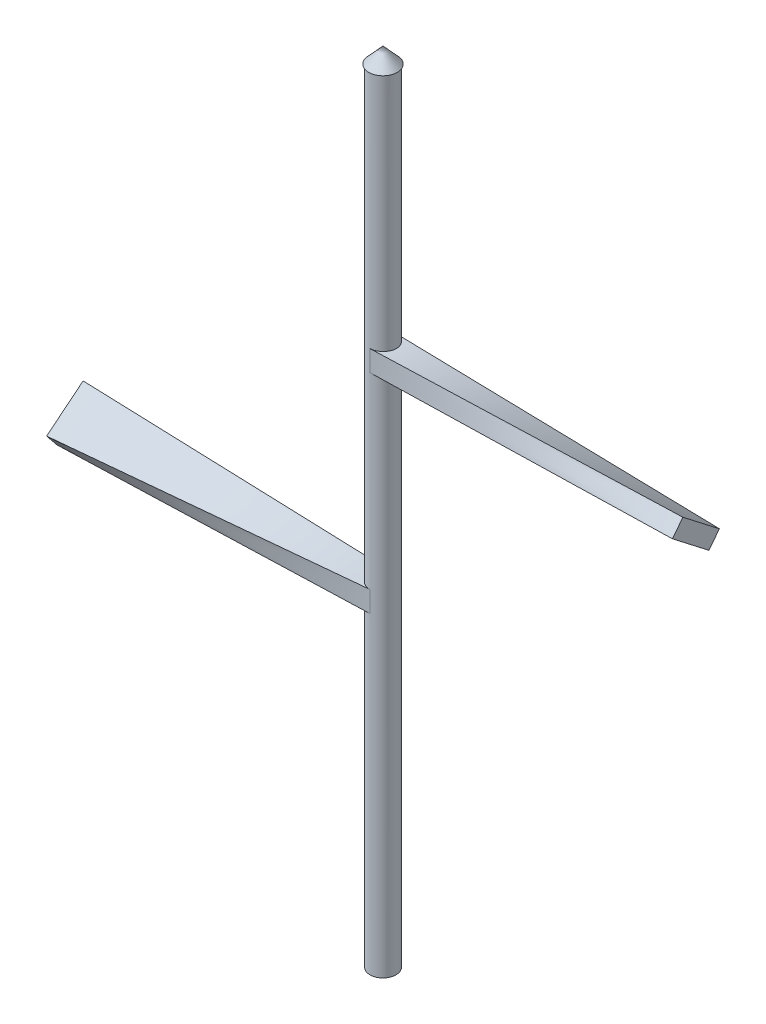
ISO-10303-21;
HEADER;
FILE_DESCRIPTION(('STEP AP214'),'2;1');
FILE_NAME('part.step','',(''),(''),'','','');
FILE_SCHEMA(('AUTOMOTIVE_DESIGN { 1 0 10303 214 1 1 1 1 }'));
ENDSEC;
DATA;
#1=APPLICATION_CONTEXT('core data for automotive mechanical design processes');
#2=APPLICATION_PROTOCOL_DEFINITION('international standard','automotive_design',2000,#1);
#3=PRODUCT_CONTEXT('',#1,'mechanical');
#4=PRODUCT('Part','Part','',(#3));
#5=PRODUCT_RELATED_PRODUCT_CATEGORY('part','',(#4));
#6=PRODUCT_DEFINITION_FORMATION('','',#4);
#7=PRODUCT_DEFINITION_CONTEXT('part definition',#1,'design');
#8=PRODUCT_DEFINITION('design','',#6,#7);
#9=PRODUCT_DEFINITION_SHAPE('','',#8);
#10=(LENGTH_UNIT() NAMED_UNIT(*) SI_UNIT(.MILLI.,.METRE.));
#11=(NAMED_UNIT(*) PLANE_ANGLE_UNIT() SI_UNIT($,.RADIAN.));
#12=(NAMED_UNIT(*) SI_UNIT($,.STERADIAN.) SOLID_ANGLE_UNIT());
#13=UNCERTAINTY_MEASURE_WITH_UNIT(LENGTH_MEASURE(1.E-05),#10,'distance_accuracy_value','');
#14=(GEOMETRIC_REPRESENTATION_CONTEXT(3) GLOBAL_UNCERTAINTY_ASSIGNED_CONTEXT((#13)) GLOBAL_UNIT_ASSIGNED_CONTEXT((#10,
#11,#12)) REPRESENTATION_CONTEXT('',''));
#15=CARTESIAN_POINT('',(0.,0.,0.));
#16=DIRECTION('',(0.,0.,1.));
#17=DIRECTION('',(1.,0.,0.));
#18=AXIS2_PLACEMENT_3D('',#15,#16,#17);
#19=CARTESIAN_POINT('',(0.,150.,0.));
#20=DIRECTION('',(0.,-1.,0.));
#21=DIRECTION('',(0.,0.,-1.));
#22=AXIS2_PLACEMENT_3D('',#19,#20,#21);
#23=CYLINDRICAL_SURFACE('',#22,2.5);
#24=DIRECTION('',(0.,1.,0.));
#25=VECTOR('',#24,1.);
#26=CARTESIAN_POINT('',(0.,100.,-2.5));
#27=LINE('',#26,#25);
#28=CARTESIAN_POINT('',(0.,100.,-2.5));
#29=VERTEX_POINT('',#28);
#30=CARTESIAN_POINT('',(0.,104.,-2.5));
#31=VERTEX_POINT('',#30);
#32=EDGE_CURVE('E61',#29,#31,#27,.T.);
#33=ORIENTED_EDGE('',*,*,#32,.F.);
#34=CARTESIAN_POINT('',(0.,100.,-2.5));
#35=CARTESIAN_POINT('',(0.0702584048415939,99.9976576322186,-2.50000655912667));
#36=CARTESIAN_POINT('',(0.140513784563137,99.9953161459847,-2.49703826712));
#37=CARTESIAN_POINT('',(0.280526146021535,99.9907165674693,-2.48520273241644));
#38=CARTESIAN_POINT('',(0.350283146028925,99.9884584721179,-2.47633570709955));
#39=CARTESIAN_POINT('',(0.488770920313989,99.9841084009593,-2.45276038404674));
#40=CARTESIAN_POINT('',(0.55750227393311,99.9820163282479,-2.43805552428509));
#41=CARTESIAN_POINT('',(0.693472263104744,99.978072177134,-2.40292192943971));
#42=CARTESIAN_POINT('',(0.760710920949553,99.9762200951456,-2.38249327989866));
#43=CARTESIAN_POINT('',(0.959547453109919,99.9711281001252,-2.31278084259678));
#44=CARTESIAN_POINT('',(1.08831540369415,99.9683508020515,-2.25506209464431));
#45=CARTESIAN_POINT('',(1.33425195770859,99.9644737576012,-2.11885689939968));
#46=CARTESIAN_POINT('',(1.45142343804616,99.9633735941727,-2.04037562081029));
#47=CARTESIAN_POINT('',(1.67073493496233,99.9630754896487,-1.86502157001248));
#48=CARTESIAN_POINT('',(1.7729039677277,99.9638738238192,-1.76818515258417));
#49=CARTESIAN_POINT('',(1.95957114399066,99.967367199174,-1.55876984295282));
#50=CARTESIAN_POINT('',(2.04406648750235,99.9700625406004,-1.44618846103269));
#51=CARTESIAN_POINT('',(2.19292102579206,99.9771206432,-1.20860660242059));
#52=CARTESIAN_POINT('',(2.25729786480343,99.9814819358053,-1.0836171353114));
#53=CARTESIAN_POINT('',(2.36421703627165,99.9914450882955,-0.824680540386848));
#54=CARTESIAN_POINT('',(2.40676041002195,99.9970468889991,-0.690733840109166));
#55=CARTESIAN_POINT('',(2.46892760178903,100.008926800215,-0.417267313309697));
#56=CARTESIAN_POINT('',(2.48848863205369,100.015206712522,-0.277733291299046));
#57=CARTESIAN_POINT('',(2.50393825596587,100.02775255579,0.00264463678888551));
#58=CARTESIAN_POINT('',(2.49982592779531,100.034018486197,0.143488593660581));
#59=CARTESIAN_POINT('',(2.46800050571145,100.045849556327,0.422815749919098));
#60=CARTESIAN_POINT('',(2.44023816678884,100.051413205958,0.561293407933878));
#61=CARTESIAN_POINT('',(2.36181280267317,100.061174703019,0.831655437760597));
#62=CARTESIAN_POINT('',(2.31115020392026,100.06537257588,0.963539932297192));
#63=CARTESIAN_POINT('',(2.18847831679041,100.07187179952,1.21667640291507));
#64=CARTESIAN_POINT('',(2.11651536692919,100.074177226617,1.33795072678713));
#65=CARTESIAN_POINT('',(1.95324618562544,100.076571451202,1.56670775669221));
#66=CARTESIAN_POINT('',(1.86194134947254,100.076660408527,1.674191456659));
#67=CARTESIAN_POINT('',(1.66298236917651,100.074518430425,1.87192092763172));
#68=CARTESIAN_POINT('',(1.55539153434483,100.072296290729,1.96223051917284));
#69=CARTESIAN_POINT('',(1.32663141731793,100.065678149089,2.12359176094705));
#70=CARTESIAN_POINT('',(1.20545802328622,100.061281487472,2.19463755709287));
#71=CARTESIAN_POINT('',(0.95291145125366,100.050673764346,2.31551113889691));
#72=CARTESIAN_POINT('',(0.821528470030512,100.044460942757,2.36531822599241));
#73=CARTESIAN_POINT('',(0.552443773385331,100.030782119729,2.44219676685281));
#74=CARTESIAN_POINT('',(0.414751387738073,100.023317927848,2.46930071616746));
#75=CARTESIAN_POINT('',(0.230100518819235,100.013025135043,2.489818216514));
#76=CARTESIAN_POINT('',(0.184120423197905,100.010439074192,2.49363848895817));
#77=CARTESIAN_POINT('',(0.0920997744488327,100.00523689554,2.49872592379748));
#78=CARTESIAN_POINT('',(0.0460594583708322,100.002620836558,2.49999743169767));
#79=CARTESIAN_POINT('',(0.,100.,2.5));
#80=B_SPLINE_CURVE_WITH_KNOTS('',3,(#34,#35,#36,#37,#38,#39,#40,#41,#42,#43,#44,#45,#46,#47,#48,
#49,#50,#51,#52,#53,#54,#55,#56,#57,#58,#59,#60,#61,#62,#63,#64,#65,#66,#67,#68,#69,#70,#71,#72,
#73,#74,#75,#76,#77,#78,#79),.UNSPECIFIED.,.F.,.F.,(4,2,2,2,2,2,2,2,2,2,2,2,2,2,2,2,2,2,2,2,2,2,
4),(0.,0.210824140476443,0.421640512096262,0.632332915030588,0.843022169311802,1.26425178750117,
1.68537664171326,2.10567595700975,2.52604180862919,2.94603795164931,3.36601406212371,
3.78713489868116,4.20827213339457,4.63028842656643,5.05229686143123,5.47339388928997,
5.89446055028876,6.31393053048177,6.73352784117477,7.15353314847114,7.57293625975724,
7.71151834173003,7.84986394713253),.UNSPECIFIED.);
#81=CARTESIAN_POINT('',(0.,100.,2.5));
#82=VERTEX_POINT('',#81);
#83=EDGE_CURVE('E12',#29,#82,#80,.T.);
#84=ORIENTED_EDGE('',*,*,#83,.T.);
#85=DIRECTION('',(0.,-1.,0.));
#86=VECTOR('',#85,1.);
#87=CARTESIAN_POINT('',(0.,100.,2.5));
#88=LINE('',#87,#86);
#89=CARTESIAN_POINT('',(0.,104.,2.5));
#90=VERTEX_POINT('',#89);
#91=EDGE_CURVE('E164',#90,#82,#88,.T.);
#92=ORIENTED_EDGE('',*,*,#91,.F.);
#93=CARTESIAN_POINT('',(0.,104.,2.5));
#94=CARTESIAN_POINT('',(0.0702584048415934,104.002342367781,2.50000655912667));
#95=CARTESIAN_POINT('',(0.140513784563137,104.004683854015,2.49703826712));
#96=CARTESIAN_POINT('',(0.280526146021536,104.009283432531,2.48520273241644));
#97=CARTESIAN_POINT('',(0.350283146028927,104.011541527882,2.47633570709955));
#98=CARTESIAN_POINT('',(0.488770920313991,104.015891599041,2.45276038404674));
#99=CARTESIAN_POINT('',(0.557502273933111,104.017983671752,2.43805552428509));
#100=CARTESIAN_POINT('',(0.693472263104745,104.021927822866,2.40292192943971));
#101=CARTESIAN_POINT('',(0.760710920949554,104.023779904854,2.38249327989866));
#102=CARTESIAN_POINT('',(0.95954745310992,104.028871899875,2.31278084259678));
#103=CARTESIAN_POINT('',(1.08831540369415,104.031649197948,2.25506209464431));
#104=CARTESIAN_POINT('',(1.33425195770859,104.035526242399,2.11885689939968));
#105=CARTESIAN_POINT('',(1.45142343804616,104.036626405827,2.04037562081029));
#106=CARTESIAN_POINT('',(1.67073493496234,104.036924510351,1.86502157001248));
#107=CARTESIAN_POINT('',(1.7729039677277,104.036126176181,1.76818515258417));
#108=CARTESIAN_POINT('',(1.95957114399066,104.032632800826,1.55876984295282));
#109=CARTESIAN_POINT('',(2.04406648750235,104.0299374594,1.44618846103268));
#110=CARTESIAN_POINT('',(2.19292102579206,104.0228793568,1.20860660242058));
#111=CARTESIAN_POINT('',(2.25729786480343,104.018518064195,1.08361713531139));
#112=CARTESIAN_POINT('',(2.36421703627165,104.008554911704,0.824680540386844));
#113=CARTESIAN_POINT('',(2.40676041002195,104.002953111001,0.690733840109162));
#114=CARTESIAN_POINT('',(2.46892760178903,103.991073199785,0.417267313309692));
#115=CARTESIAN_POINT('',(2.48848863205369,103.984793287478,0.277733291299043));
#116=CARTESIAN_POINT('',(2.50393825596587,103.97224744421,-0.00264463678888768));
#117=CARTESIAN_POINT('',(2.49982592779531,103.965981513803,-0.143488593660584));
#118=CARTESIAN_POINT('',(2.46800050571145,103.954150443673,-0.422815749919101));
#119=CARTESIAN_POINT('',(2.44023816678884,103.948586794042,-0.561293407933881));
#120=CARTESIAN_POINT('',(2.36181280267317,103.938825296981,-0.831655437760601));
#121=CARTESIAN_POINT('',(2.31115020392026,103.93462742412,-0.963539932297197));
#122=CARTESIAN_POINT('',(2.1884783167904,103.92812820048,-1.21667640291507));
#123=CARTESIAN_POINT('',(2.11651536692918,103.925822773383,-1.33795072678713));
#124=CARTESIAN_POINT('',(1.95324618562544,103.923428548798,-1.56670775669221));
#125=CARTESIAN_POINT('',(1.86194134947254,103.923339591473,-1.674191456659));
#126=CARTESIAN_POINT('',(1.66298236917651,103.925481569575,-1.87192092763172));
#127=CARTESIAN_POINT('',(1.55539153434483,103.927703709271,-1.96223051917284));
#128=CARTESIAN_POINT('',(1.32663141731793,103.934321850911,-2.12359176094706));
#129=CARTESIAN_POINT('',(1.20545802328621,103.938718512528,-2.19463755709287));
#130=CARTESIAN_POINT('',(0.952911451253658,103.949326235654,-2.31551113889691));
#131=CARTESIAN_POINT('',(0.821528470030512,103.955539057243,-2.36531822599242));
#132=CARTESIAN_POINT('',(0.55244377338533,103.969217880271,-2.44219676685281));
#133=CARTESIAN_POINT('',(0.414751387738071,103.976682072152,-2.46930071616745));
#134=CARTESIAN_POINT('',(0.230100518819235,103.986974864957,-2.489818216514));
#135=CARTESIAN_POINT('',(0.184120423197906,103.989560925808,-2.49363848895817));
#136=CARTESIAN_POINT('',(0.0920997744488342,103.99476310446,-2.49872592379748));
#137=CARTESIAN_POINT('',(0.0460594583708336,103.997379163442,-2.49999743169767));
#138=CARTESIAN_POINT('',(0.,104.,-2.5));
#139=B_SPLINE_CURVE_WITH_KNOTS('',3,(#93,#94,#95,#96,#97,#98,#99,#100,#101,#102,#103,#104,#105,
#106,#107,#108,#109,#110,#111,#112,#113,#114,#115,#116,#117,#118,#119,#120,#121,#122,#123,#124,
#125,#126,#127,#128,#129,#130,#131,#132,#133,#134,#135,#136,#137,#138),.UNSPECIFIED.,.F.,.F.,(4,
2,2,2,2,2,2,2,2,2,2,2,2,2,2,2,2,2,2,2,2,2,4),(0.,0.210824140476443,0.421640512096263,
0.632332915030589,0.843022169311803,1.26425178750117,1.68537664171327,2.10567595700975,
2.52604180862919,2.94603795164931,3.36601406212372,3.78713489868117,4.20827213339457,
4.63028842656643,5.05229686143123,5.47339388928997,5.89446055028876,6.31393053048177,
6.73352784117478,7.15353314847115,7.57293625975723,7.71151834173003,7.84986394713253),.UNSPECIFIED.);
#140=EDGE_CURVE('E68',#90,#31,#139,.T.);
#141=ORIENTED_EDGE('',*,*,#140,.T.);
#142=EDGE_LOOP('',(#33,#84,#92,#141));
#143=FACE_BOUND('',#142,.T.);
#144=CARTESIAN_POINT('',(0.,64.,-2.5));
#145=CARTESIAN_POINT('',(-0.070253171884218,64.0025038124168,-2.5000065378278));
#146=CARTESIAN_POINT('',(-0.140503337708207,64.0050067017248,-2.49703870703915));
#147=CARTESIAN_POINT('',(-0.280505799307064,64.0099248428953,-2.48520489470651));
#148=CARTESIAN_POINT('',(-0.350258112724583,64.0123400978758,-2.47633912323032));
#149=CARTESIAN_POINT('',(-0.488738280731921,64.0169960314195,-2.45276678491321));
#150=CARTESIAN_POINT('',(-0.557466701054271,64.0192368095165,-2.43806357779134));
#151=CARTESIAN_POINT('',(-0.693431841841638,64.0234660797212,-2.40293351321847));
#152=CARTESIAN_POINT('',(-0.76066858503533,64.0254545756752,-2.38250674304211));
#153=CARTESIAN_POINT('',(-0.95950210082307,64.0309320427756,-2.31279949224505));
#154=CARTESIAN_POINT('',(-1.08827067283518,64.0339347069079,-2.25508377265722));
#155=CARTESIAN_POINT('',(-1.33421118805541,64.0381753402809,-2.11888257614063));
#156=CARTESIAN_POINT('',(-1.45138607431908,64.0394137584503,-2.04040238895059));
#157=CARTESIAN_POINT('',(-1.67068033885718,64.0398879850759,-1.86506832017234));
#158=CARTESIAN_POINT('',(-1.7728320586053,64.0391281639547,-1.76825496571874));
#159=CARTESIAN_POINT('',(-1.95947165211729,64.0356106675047,-1.55889231278482));
#160=CARTESIAN_POINT('',(-2.04395672023821,64.0328526751561,-1.44634051961017));
#161=CARTESIAN_POINT('',(-2.19278891492967,64.0255774480267,-1.20884053722357));
#162=CARTESIAN_POINT('',(-2.25715629479556,64.0210619929083,-1.08390498328533));
#163=CARTESIAN_POINT('',(-2.36407306429519,64.0107169786385,-0.825084071320989));
#164=CARTESIAN_POINT('',(-2.40662346329096,64.0048874802993,-0.691199127662156));
#165=CARTESIAN_POINT('',(-2.46883219109955,63.9925018785632,-0.417824016793933));
#166=CARTESIAN_POINT('',(-2.48842188951259,63.9859436606303,-0.278318327874358));
#167=CARTESIAN_POINT('',(-2.5039375109802,63.9728233636013,0.002007603543178));
#168=CARTESIAN_POINT('',(-2.49986246906174,63.9662612843588,0.142827899412874));
#169=CARTESIAN_POINT('',(-2.46811466478618,63.9538502586572,0.42215289855813));
#170=CARTESIAN_POINT('',(-2.44038666630136,63.9480030181151,0.560651407253054));
#171=CARTESIAN_POINT('',(-2.36202201374373,63.9377206691581,0.831063674889947));
#172=CARTESIAN_POINT('',(-2.31138581083384,63.9332855329357,0.962977563455134));
#173=CARTESIAN_POINT('',(-2.18876503943008,63.926385254899,1.2161604383166));
#174=CARTESIAN_POINT('',(-2.11682997484023,63.9239155933824,1.33745327275595));
#175=CARTESIAN_POINT('',(-1.95361079663825,63.9212823021598,1.56625331128603));
#176=CARTESIAN_POINT('',(-1.86232811920887,63.9211185013493,1.67376153766479));
#177=CARTESIAN_POINT('',(-1.66344261970678,63.923207302732,1.8715086934876));
#178=CARTESIAN_POINT('',(-1.55590878748201,63.9254499236392,1.96181714077756));
#179=CARTESIAN_POINT('',(-1.32726897033966,63.9321997828831,2.12319032744711));
#180=CARTESIAN_POINT('',(-1.20615889652163,63.936707704916,2.19424924710781));
#181=CARTESIAN_POINT('',(-0.953746306898589,63.9476147735161,2.31516419140071));
#182=CARTESIAN_POINT('',(-0.822434200804892,63.9540157158476,2.36499997323069));
#183=CARTESIAN_POINT('',(-0.55349135216114,63.9681251494521,2.44195634061913));
#184=CARTESIAN_POINT('',(-0.415869882611662,63.9758317640147,2.46910920188487));
#185=CARTESIAN_POINT('',(-0.231090380651679,63.9864765867563,2.48973024985742));
#186=CARTESIAN_POINT('',(-0.184912990630358,63.989161201253,2.49358353481704));
#187=CARTESIAN_POINT('',(-0.0924966510669358,63.9945622426746,2.49871492563506));
#188=CARTESIAN_POINT('',(-0.0462579420412805,63.9972786073086,2.49999742637732));
#189=CARTESIAN_POINT('',(0.,64.,2.5));
#190=B_SPLINE_CURVE_WITH_KNOTS('',3,(#144,#145,#146,#147,#148,#149,#150,#151,#152,#153,#154,
#155,#156,#157,#158,#159,#160,#161,#162,#163,#164,#165,#166,#167,#168,#169,#170,#171,#172,#173,
#174,#175,#176,#177,#178,#179,#180,#181,#182,#183,#184,#185,#186,#187,#188,#189),.UNSPECIFIED.,
.F.,.F.,(4,2,2,2,2,2,2,2,2,2,2,2,2,2,2,2,2,2,2,2,2,2,4),(0.,0.210825190348227,0.421642872107563,
0.632339393855028,0.843032703013024,1.26427344062697,1.68540697050397,2.10562019018408,
2.52590009337624,2.94575551054903,3.36559150136952,3.78667922317472,4.20778411572184,
4.6298751040861,5.05195777999098,5.47306702943345,5.89414503067163,6.31348322386356,
6.73294805463915,7.15281208314751,7.57207766125695,7.71127286460633,7.85022990317063),.UNSPECIFIED.);
#191=CARTESIAN_POINT('',(0.,64.0000000000014,-2.5));
#192=VERTEX_POINT('',#191);
#193=CARTESIAN_POINT('',(0.,64.,2.5));
#194=VERTEX_POINT('',#193);
#195=EDGE_CURVE('E515',#192,#194,#190,.T.);
#196=ORIENTED_EDGE('',*,*,#195,.T.);
#197=DIRECTION('',(0.,-1.,0.));
#198=VECTOR('',#197,1.);
#199=CARTESIAN_POINT('',(0.,60.,2.5));
#200=LINE('',#199,#198);
#201=CARTESIAN_POINT('',(0.,60.,2.5));
#202=VERTEX_POINT('',#201);
#203=EDGE_CURVE('E337',#194,#202,#200,.T.);
#204=ORIENTED_EDGE('',*,*,#203,.T.);
#205=CARTESIAN_POINT('',(0.,60.,2.5));
#206=CARTESIAN_POINT('',(-0.0702527969150094,59.9976577997655,2.50000655147175));
#207=CARTESIAN_POINT('',(-0.140502578825205,59.9953165167065,2.49703873938094));
#208=CARTESIAN_POINT('',(-0.280504008092741,59.9907204498881,2.48520507785324));
#209=CARTESIAN_POINT('',(-0.350255673378449,59.9884656630025,2.47633944178508));
#210=CARTESIAN_POINT('',(-0.488733619301485,59.9841283340108,2.45276767499933));
#211=CARTESIAN_POINT('',(-0.557460472955953,59.9820456924452,2.43806494564606));
#212=CARTESIAN_POINT('',(-0.69342195477876,59.9781292654996,2.40293630944267));
#213=CARTESIAN_POINT('',(-0.760656605514443,59.9762954763538,2.3825104892095));
#214=CARTESIAN_POINT('',(-0.959482547207748,59.9712755099404,2.31280725137865));
#215=CARTESIAN_POINT('',(-1.08824473786535,59.9685691184443,2.25509568983023));
#216=CARTESIAN_POINT('',(-1.33417111426784,59.9648941415935,2.11890721668262));
#217=CARTESIAN_POINT('',(-1.45133821581693,59.9639251182903,2.0404355439314));
#218=CARTESIAN_POINT('',(-1.67062947053721,59.9639546680744,1.86511408466713));
#219=CARTESIAN_POINT('',(-1.77278433330633,59.9649491625771,1.7683027705553));
#220=CARTESIAN_POINT('',(-1.95942914284807,59.9688953402579,1.5589457278831));
#221=CARTESIAN_POINT('',(-2.04391627263972,59.9718473352316,1.44639749496112));
#222=CARTESIAN_POINT('',(-2.19276473971063,59.9794648209756,1.20888667351689));
#223=CARTESIAN_POINT('',(-2.25714321477403,59.9841288452376,1.08393477649287));
#224=CARTESIAN_POINT('',(-2.36407642807152,59.9947212169921,0.825077798768885));
#225=CARTESIAN_POINT('',(-2.40663217009598,60.0006495063138,0.691173130194014));
#226=CARTESIAN_POINT('',(-2.46884517295777,60.013180286222,0.417754663089677));
#227=CARTESIAN_POINT('',(-2.48843367393131,60.0197847372692,0.278225308462723));
#228=CARTESIAN_POINT('',(-2.50393874438485,60.0329429715453,-0.00214988960053474));
#229=CARTESIAN_POINT('',(-2.49985436949641,60.0394967527424,-0.142995785333081));
#230=CARTESIAN_POINT('',(-2.468081378002,60.0518353768941,-0.422348799055669));
#231=CARTESIAN_POINT('',(-2.44034133402629,60.0576185127711,-0.560850150464521));
#232=CARTESIAN_POINT('',(-2.36195094204194,60.0677195583052,-0.831266545526496));
#233=CARTESIAN_POINT('',(-2.31130107419357,60.0720374986676,-0.963181727152882));
#234=CARTESIAN_POINT('',(-2.18866388922046,60.078653233873,-1.21634011293473));
#235=CARTESIAN_POINT('',(-2.11673004285035,60.0809560345574,-1.33760908470625));
#236=CARTESIAN_POINT('',(-1.95352190384461,60.0832117245833,-1.56636217733326));
#237=CARTESIAN_POINT('',(-1.86224905325937,60.0831647890761,-1.67384732504758));
#238=CARTESIAN_POINT('',(-1.66339609380616,60.0806179649605,-1.87154780339159));
#239=CARTESIAN_POINT('',(-1.55588544513205,60.0781282875539,-1.9618331571124));
#240=CARTESIAN_POINT('',(-1.32730291943691,60.0708543815013,-2.12316682490628));
#241=CARTESIAN_POINT('',(-1.20622694919535,60.0660694588477,-2.19420931038845));
#242=CARTESIAN_POINT('',(-0.953871359572034,60.0545851802151,-2.31511163129533));
#243=CARTESIAN_POINT('',(-0.82258052904572,60.047883698543,-2.36494779282647));
#244=CARTESIAN_POINT('',(-0.553684013915809,60.033158976334,-2.44191147677551));
#245=CARTESIAN_POINT('',(-0.416087578079909,60.0251376296036,-2.46907120213091));
#246=CARTESIAN_POINT('',(-0.231292900481339,60.0140671976331,-2.48971220480168));
#247=CARTESIAN_POINT('',(-0.185075094510981,60.0112739669301,-2.493572265424));
#248=CARTESIAN_POINT('',(-0.0925777783029553,60.0056554755155,-2.49871267333773));
#249=CARTESIAN_POINT('',(-0.0462985092071827,60.0028302778341,-2.49999742627932));
#250=CARTESIAN_POINT('',(0.,60.,-2.5));
#251=B_SPLINE_CURVE_WITH_KNOTS('',3,(#205,#206,#207,#208,#209,#210,#211,#212,#213,#214,#215,
#216,#217,#218,#219,#220,#221,#222,#223,#224,#225,#226,#227,#228,#229,#230,#231,#232,#233,#234,
#235,#236,#237,#238,#239,#240,#241,#242,#243,#244,#245,#246,#247,#248,#249,#250),.UNSPECIFIED.,
.F.,.F.,(4,2,2,2,2,2,2,2,2,2,2,2,2,2,2,2,2,2,2,2,2,2,4),(0.,0.210807339037184,0.421607051998983,
0.63228410858744,0.842957976825325,1.26415864990337,1.68525313352361,2.10547384731568,
2.52576151099437,2.94568999712437,3.36559916587621,3.78676228431101,4.20794220407979,
4.63004010917243,5.05212916804883,5.47316670763569,5.89417286278332,6.31342658472497,
6.73280715536053,7.15265468520301,7.57190496812712,7.7112415360016,7.85033953282088),.UNSPECIFIED.);
#252=CARTESIAN_POINT('',(0.,60.,-2.5));
#253=VERTEX_POINT('',#252);
#254=EDGE_CURVE('E498',#202,#253,#251,.T.);
#255=ORIENTED_EDGE('',*,*,#254,.T.);
#256=DIRECTION('',(0.,1.,0.));
#257=VECTOR('',#256,1.);
#258=CARTESIAN_POINT('',(0.,60.,-2.5));
#259=LINE('',#258,#257);
#260=EDGE_CURVE('E307',#253,#192,#259,.T.);
#261=ORIENTED_EDGE('',*,*,#260,.T.);
#262=EDGE_LOOP('',(#196,#204,#255,#261));
#263=FACE_BOUND('',#262,.T.);
#264=CARTESIAN_POINT('',(0.,150.,0.));
#265=DIRECTION('',(0.,1.,0.));
#266=DIRECTION('',(0.,0.,1.));
#267=AXIS2_PLACEMENT_3D('',#264,#265,#266);
#268=CIRCLE('',#267,2.5);
#269=CARTESIAN_POINT('',(0.,150.,2.5));
#270=VERTEX_POINT('',#269);
#271=EDGE_CURVE('E494',#270,#270,#268,.T.);
#272=ORIENTED_EDGE('',*,*,#271,.F.);
#273=EDGE_LOOP('',(#272));
#274=FACE_BOUND('',#273,.T.);
#275=DIRECTION('',(0.,-1.,0.));
#276=VECTOR('',#275,1.);
#277=CARTESIAN_POINT('',(-1.33316955610599,10.,-2.11486617417561));
#278=LINE('',#277,#276);
#279=CARTESIAN_POINT('',(-1.33316955610599,10.,-2.11486617417561));
#280=VERTEX_POINT('',#279);
#281=CARTESIAN_POINT('',(-1.33316955610599,0.,-2.11486617417561));
#282=VERTEX_POINT('',#281);
#283=EDGE_CURVE('E483',#280,#282,#278,.T.);
#284=ORIENTED_EDGE('',*,*,#283,.F.);
#285=CARTESIAN_POINT('',(0.,10.,0.));
#286=DIRECTION('',(0.,-1.,0.));
#287=DIRECTION('',(0.,0.,-1.));
#288=AXIS2_PLACEMENT_3D('',#285,#286,#287);
#289=CIRCLE('',#288,2.5);
#290=CARTESIAN_POINT('',(-2.42946149862482,10.,0.589675187454604));
#291=VERTEX_POINT('',#290);
#292=EDGE_CURVE('E475',#291,#280,#289,.T.);
#293=ORIENTED_EDGE('',*,*,#292,.F.);
#294=DIRECTION('',(0.,-1.,0.));
#295=VECTOR('',#294,1.);
#296=CARTESIAN_POINT('',(-2.42946149862482,10.,0.589675187454604));
#297=LINE('',#296,#295);
#298=CARTESIAN_POINT('',(-2.42946149862482,0.,0.589675187454604));
#299=VERTEX_POINT('',#298);
#300=EDGE_CURVE('E479',#291,#299,#297,.T.);
#301=ORIENTED_EDGE('',*,*,#300,.T.);
#302=CARTESIAN_POINT('',(0.,0.,0.));
#303=DIRECTION('',(0.,1.,0.));
#304=DIRECTION('',(0.,0.,1.));
#305=AXIS2_PLACEMENT_3D('',#302,#303,#304);
#306=CIRCLE('',#305,2.5);
#307=EDGE_CURVE('E493',#299,#282,#306,.T.);
#308=ORIENTED_EDGE('',*,*,#307,.T.);
#309=EDGE_LOOP('',(#284,#293,#301,#308));
#310=FACE_BOUND('',#309,.T.);
#311=ADVANCED_FACE('F57',(#143,#263,#274,#310),#23,.T.);
#312=CARTESIAN_POINT('',(0.,0.,0.));
#313=DIRECTION('',(0.,1.,0.));
#314=DIRECTION('',(0.,0.,1.));
#315=AXIS2_PLACEMENT_3D('',#312,#313,#314);
#316=PLANE('',#315);
#317=DIRECTION('',(0.375662804611088,0.,-0.926756417421391));
#318=VECTOR('',#317,1.);
#319=CARTESIAN_POINT('',(-1.88131552736541,0.,-0.762595493360501));
#320=LINE('',#319,#318);
#321=EDGE_CURVE('E453',#299,#282,#320,.T.);
#322=ORIENTED_EDGE('',*,*,#321,.T.);
#323=ORIENTED_EDGE('',*,*,#307,.F.);
#324=EDGE_LOOP('',(#322,#323));
#325=FACE_BOUND('',#324,.T.);
#326=ADVANCED_FACE('F608',(#325),#316,.F.);
#327=CARTESIAN_POINT('',(0.,153.,0.));
#328=DIRECTION('',(0.,-1.,0.));
#329=DIRECTION('',(0.,0.,-1.));
#330=AXIS2_PLACEMENT_3D('',#327,#328,#329);
#331=CONICAL_SURFACE('',#330,0.,0.741947268005913);
#332=CARTESIAN_POINT('',(0.,150.,0.));
#333=DIRECTION('',(0.,1.,0.));
#334=DIRECTION('',(0.,0.,1.));
#335=AXIS2_PLACEMENT_3D('',#332,#333,#334);
#336=CIRCLE('',#335,2.75);
#337=CARTESIAN_POINT('',(0.,150.,2.75));
#338=VERTEX_POINT('',#337);
#339=EDGE_CURVE('E486',#338,#338,#336,.T.);
#340=ORIENTED_EDGE('',*,*,#339,.T.);
#341=EDGE_LOOP('',(#340));
#342=FACE_BOUND('',#341,.T.);
#343=CARTESIAN_POINT('',(0.,153.,0.));
#344=VERTEX_POINT('',#343);
#345=VERTEX_LOOP('',#344);
#346=FACE_BOUND('',#345,.T.);
#347=ADVANCED_FACE('F619',(#342,#346),#331,.T.);
#348=CARTESIAN_POINT('',(0.,150.,0.));
#349=DIRECTION('',(0.,-1.,0.));
#350=DIRECTION('',(0.,0.,-1.));
#351=AXIS2_PLACEMENT_3D('',#348,#349,#350);
#352=PLANE('',#351);
#353=ORIENTED_EDGE('',*,*,#271,.T.);
#354=EDGE_LOOP('',(#353));
#355=FACE_BOUND('',#354,.T.);
#356=ORIENTED_EDGE('',*,*,#339,.F.);
#357=EDGE_LOOP('',(#356));
#358=FACE_BOUND('',#357,.T.);
#359=ADVANCED_FACE('F624',(#355,#358),#352,.T.);
#360=CARTESIAN_POINT('',(-1.88131552736541,10.,-0.762595493360501));
#361=DIRECTION('',(-0.926756417421391,0.,-0.375662804611088));
#362=DIRECTION('',(-0.375662804611088,0.,0.926756417421391));
#363=AXIS2_PLACEMENT_3D('',#360,#361,#362);
#364=PLANE('',#363);
#365=ORIENTED_EDGE('',*,*,#321,.F.);
#366=ORIENTED_EDGE('',*,*,#300,.F.);
#367=DIRECTION('',(0.375662804611088,0.,-0.926756417421391));
#368=VECTOR('',#367,1.);
#369=CARTESIAN_POINT('',(-1.88131552736541,10.,-0.762595493360501));
#370=LINE('',#369,#368);
#371=EDGE_CURVE('E467',#291,#280,#370,.T.);
#372=ORIENTED_EDGE('',*,*,#371,.T.);
#373=ORIENTED_EDGE('',*,*,#283,.T.);
#374=EDGE_LOOP('',(#365,#366,#372,#373));
#375=FACE_BOUND('',#374,.T.);
#376=ADVANCED_FACE('F615',(#375),#364,.T.);
#377=CARTESIAN_POINT('',(0.,10.,0.));
#378=DIRECTION('',(0.,-1.,0.));
#379=DIRECTION('',(0.,0.,-1.));
#380=AXIS2_PLACEMENT_3D('',#377,#378,#379);
#381=PLANE('',#380);
#382=ORIENTED_EDGE('',*,*,#371,.F.);
#383=ORIENTED_EDGE('',*,*,#292,.T.);
#384=EDGE_LOOP('',(#382,#383));
#385=FACE_BOUND('',#384,.T.);
#386=ADVANCED_FACE('F632',(#385),#381,.T.);
#387=CARTESIAN_POINT('',(0.,64.,2.5));
#388=CARTESIAN_POINT('',(-60.,60.4700007874602,4.5));
#389=CARTESIAN_POINT('',(0.,64.,1.66666666666667));
#390=CARTESIAN_POINT('',(-60.,61.4146698520124,3.33333333333336));
#391=CARTESIAN_POINT('',(0.,64.,0.833333333333335));
#392=CARTESIAN_POINT('',(-60.,62.3593389165647,2.1666666666667));
#393=CARTESIAN_POINT('',(0.,64.,-0.833333333333331));
#394=CARTESIAN_POINT('',(-60.,64.2486770456692,-0.166666666666635));
#395=CARTESIAN_POINT('',(0.,64.,-1.66666666666666));
#396=CARTESIAN_POINT('',(-60.,65.1933461102214,-1.33333333333331));
#397=CARTESIAN_POINT('',(0.,64.,-2.5));
#398=CARTESIAN_POINT('',(-60.,66.1380151747737,-2.5));
#399=B_SPLINE_SURFACE_WITH_KNOTS('',3,1,((#387,#388),(#389,#390),(#391,#392),(#393,#394),(#395,
#396),(#397,#398)),.UNSPECIFIED.,.F.,.F.,.F.,(4,2,4),(2,2),(0.,0.5,1.),(0.,1.),.UNSPECIFIED.);
#400=DIRECTION('',(-0.99936572772833,0.035610984850532,0.));
#401=VECTOR('',#400,1.);
#402=CARTESIAN_POINT('',(-30.,65.0690075873868,-2.5));
#403=LINE('',#402,#401);
#404=CARTESIAN_POINT('',(-60.,66.1380151747737,-2.5));
#405=VERTEX_POINT('',#404);
#406=EDGE_CURVE('E84',#192,#405,#403,.T.);
#407=DIRECTION('',(0.,-0.629288617359403,0.777171690208728));
#408=VECTOR('',#407,1.);
#409=CARTESIAN_POINT('',(-60.,66.1380151747737,-2.5));
#410=LINE('',#409,#408);
#411=CARTESIAN_POINT('',(-60.,60.4700007874602,4.5));
#412=VERTEX_POINT('',#411);
#413=EDGE_CURVE('E387',#405,#412,#410,.T.);
#414=DIRECTION('',(-0.997721575213462,-0.0586992729139585,0.0332573858404487));
#415=VECTOR('',#414,1.);
#416=CARTESIAN_POINT('',(-30.,62.2350003937301,3.5));
#417=LINE('',#416,#415);
#418=EDGE_CURVE('E336',#194,#412,#417,.T.);
#419=ORIENTED_EDGE('',*,*,#195,.F.);
#420=ORIENTED_EDGE('',*,*,#406,.T.);
#421=ORIENTED_EDGE('',*,*,#413,.T.);
#422=ORIENTED_EDGE('',*,*,#418,.F.);
#423=EDGE_LOOP('',(#419,#420,#421,#422));
#424=FACE_BOUND('',#423,.T.);
#425=ADVANCED_FACE('F361',(#424),#399,.T.);
#426=CARTESIAN_POINT('',(0.,60.,-2.5));
#427=CARTESIAN_POINT('',(-60.,63.6680143873135,-4.50000000000001));
#428=CARTESIAN_POINT('',(0.,60.,-1.66666666666667));
#429=CARTESIAN_POINT('',(-60.,62.7233453227615,-3.33333333333363));
#430=CARTESIAN_POINT('',(0.,60.,-0.833333333333335));
#431=CARTESIAN_POINT('',(-60.,61.7786762582093,-2.16666666666711));
#432=CARTESIAN_POINT('',(0.,60.,0.833333333333332));
#433=CARTESIAN_POINT('',(-60.,59.8893381291048,0.166666666666228));
#434=CARTESIAN_POINT('',(0.,60.,1.66666666666667));
#435=CARTESIAN_POINT('',(-60.,58.9446690645525,1.33333333333304));
#436=CARTESIAN_POINT('',(0.,60.,2.5));
#437=CARTESIAN_POINT('',(-60.,58.,2.5));
#438=B_SPLINE_SURFACE_WITH_KNOTS('',3,1,((#426,#427),(#428,#429),(#430,#431),(#432,#433),(#434,
#435),(#436,#437)),.UNSPECIFIED.,.F.,.F.,.F.,(4,2,4),(2,2),(0.,0.5,1.),(0.,1.),.UNSPECIFIED.);
#439=DIRECTION('',(0.999444906979154,0.0333148302326385,0.));
#440=VECTOR('',#439,1.);
#441=CARTESIAN_POINT('',(-30.,59.,2.5));
#442=LINE('',#441,#440);
#443=CARTESIAN_POINT('',(-60.,58.,2.5));
#444=VERTEX_POINT('',#443);
#445=EDGE_CURVE('E332',#444,#202,#442,.T.);
#446=DIRECTION('',(0.,0.629288617359403,-0.777171690208728));
#447=VECTOR('',#446,1.);
#448=CARTESIAN_POINT('',(-60.,63.6680143873135,-4.50000000000001));
#449=LINE('',#448,#447);
#450=CARTESIAN_POINT('',(-60.,63.6680143873135,-4.50000000000001));
#451=VERTEX_POINT('',#450);
#452=EDGE_CURVE('E441',#444,#451,#449,.T.);
#453=DIRECTION('',(-0.997584567305906,0.0609859090906662,-0.0332528189101969));
#454=VECTOR('',#453,1.);
#455=CARTESIAN_POINT('',(-30.,61.8340071936567,-3.5));
#456=LINE('',#455,#454);
#457=EDGE_CURVE('E321',#253,#451,#456,.T.);
#458=ORIENTED_EDGE('',*,*,#254,.F.);
#459=ORIENTED_EDGE('',*,*,#445,.F.);
#460=ORIENTED_EDGE('',*,*,#452,.T.);
#461=ORIENTED_EDGE('',*,*,#457,.F.);
#462=EDGE_LOOP('',(#458,#459,#460,#461));
#463=FACE_BOUND('',#462,.T.);
#464=ADVANCED_FACE('F414',(#463),#438,.T.);
#465=CARTESIAN_POINT('',(-60.,0.,0.));
#466=DIRECTION('',(1.,0.,0.));
#467=DIRECTION('',(0.,0.,-1.));
#468=AXIS2_PLACEMENT_3D('',#465,#466,#467);
#469=PLANE('',#468);
#470=DIRECTION('',(0.,0.777171690208728,0.629288617359403));
#471=VECTOR('',#470,1.);
#472=CARTESIAN_POINT('',(-60.,63.6680143873135,-4.50000000000001));
#473=LINE('',#472,#471);
#474=EDGE_CURVE('E329',#451,#405,#473,.T.);
#475=ORIENTED_EDGE('',*,*,#474,.F.);
#476=ORIENTED_EDGE('',*,*,#452,.F.);
#477=DIRECTION('',(0.,-0.777171690208728,-0.629288617359403));
#478=VECTOR('',#477,1.);
#479=CARTESIAN_POINT('',(-60.,58.,2.5));
#480=LINE('',#479,#478);
#481=EDGE_CURVE('E454',#412,#444,#480,.T.);
#482=ORIENTED_EDGE('',*,*,#481,.F.);
#483=ORIENTED_EDGE('',*,*,#413,.F.);
#484=EDGE_LOOP('',(#475,#476,#482,#483));
#485=FACE_BOUND('',#484,.T.);
#486=ADVANCED_FACE('F360',(#485),#469,.F.);
#487=CARTESIAN_POINT('',(0.,60.,2.5));
#488=CARTESIAN_POINT('',(-60.,58.,2.5));
#489=CARTESIAN_POINT('',(0.,60.6666666666666,2.5));
#490=CARTESIAN_POINT('',(-60.,58.41166679791,2.83333333333334));
#491=CARTESIAN_POINT('',(0.,61.3333333333332,2.5));
#492=CARTESIAN_POINT('',(-60.,58.8233335958201,3.16666666666667));
#493=CARTESIAN_POINT('',(0.,62.6666666666666,2.5));
#494=CARTESIAN_POINT('',(-60.,59.6466671916401,3.83333333333334));
#495=CARTESIAN_POINT('',(0.,63.3333333333333,2.5));
#496=CARTESIAN_POINT('',(-60.,60.0583339895502,4.16666666666667));
#497=CARTESIAN_POINT('',(0.,64.,2.5));
#498=CARTESIAN_POINT('',(-60.,60.4700007874602,4.5));
#499=B_SPLINE_SURFACE_WITH_KNOTS('',3,1,((#487,#488),(#489,#490),(#491,#492),(#493,#494),(#495,
#496),(#497,#498)),.UNSPECIFIED.,.F.,.F.,.F.,(4,2,4),(2,2),(0.,0.5,1.),(0.,1.),.UNSPECIFIED.);
#500=ORIENTED_EDGE('',*,*,#203,.F.);
#501=ORIENTED_EDGE('',*,*,#418,.T.);
#502=ORIENTED_EDGE('',*,*,#481,.T.);
#503=ORIENTED_EDGE('',*,*,#445,.T.);
#504=EDGE_LOOP('',(#500,#501,#502,#503));
#505=FACE_BOUND('',#504,.T.);
#506=ADVANCED_FACE('F349',(#505),#499,.T.);
#507=CARTESIAN_POINT('',(0.,64.,-2.5));
#508=CARTESIAN_POINT('',(-60.,66.1380151747737,-2.5));
#509=CARTESIAN_POINT('',(0.,63.3333333333335,-2.5));
#510=CARTESIAN_POINT('',(-60.,65.7263483768637,-2.83333333333333));
#511=CARTESIAN_POINT('',(0.,62.6666666666669,-2.5));
#512=CARTESIAN_POINT('',(-60.,65.3146815789536,-3.16666666666667));
#513=CARTESIAN_POINT('',(0.,61.3333333333335,-2.5));
#514=CARTESIAN_POINT('',(-60.,64.4913479831336,-3.83333333333334));
#515=CARTESIAN_POINT('',(0.,60.6666666666668,-2.5));
#516=CARTESIAN_POINT('',(-60.,64.0796811852235,-4.16666666666667));
#517=CARTESIAN_POINT('',(0.,60.,-2.5));
#518=CARTESIAN_POINT('',(-60.,63.6680143873135,-4.50000000000001));
#519=B_SPLINE_SURFACE_WITH_KNOTS('',3,1,((#507,#508),(#509,#510),(#511,#512),(#513,#514),(#515,
#516),(#517,#518)),.UNSPECIFIED.,.F.,.F.,.F.,(4,2,4),(2,2),(0.,0.5,1.),(0.,1.),.UNSPECIFIED.);
#520=ORIENTED_EDGE('',*,*,#260,.F.);
#521=ORIENTED_EDGE('',*,*,#457,.T.);
#522=ORIENTED_EDGE('',*,*,#474,.T.);
#523=ORIENTED_EDGE('',*,*,#406,.F.);
#524=EDGE_LOOP('',(#520,#521,#522,#523));
#525=FACE_BOUND('',#524,.T.);
#526=ADVANCED_FACE('F191',(#525),#519,.T.);
#527=CARTESIAN_POINT('',(0.,100.,2.5));
#528=CARTESIAN_POINT('',(60.,103.414213562373,4.5));
#529=CARTESIAN_POINT('',(0.,100.,1.66666666666667));
#530=CARTESIAN_POINT('',(60.,102.511844635311,3.33333333333338));
#531=CARTESIAN_POINT('',(0.,100.,0.833333333333335));
#532=CARTESIAN_POINT('',(60.,101.609475708249,2.16666666666674));
#533=CARTESIAN_POINT('',(0.,100.,-0.833333333333332));
#534=CARTESIAN_POINT('',(60.,99.8047378541246,-0.166666666666596));
#535=CARTESIAN_POINT('',(0.,100.,-1.66666666666667));
#536=CARTESIAN_POINT('',(60.,98.9023689270623,-1.33333333333329));
#537=CARTESIAN_POINT('',(0.,100.,-2.5));
#538=CARTESIAN_POINT('',(60.,98.,-2.5));
#539=B_SPLINE_SURFACE_WITH_KNOTS('',3,1,((#527,#528),(#529,#530),(#531,#532),(#533,#534),(#535,
#536),(#537,#538)),.UNSPECIFIED.,.F.,.F.,.F.,(4,2,4),(2,2),(0.,0.5,1.),(0.,1.),.UNSPECIFIED.);
#540=DIRECTION('',(0.999444906979154,-0.0333148302326385,0.));
#541=VECTOR('',#540,1.);
#542=CARTESIAN_POINT('',(30.,99.,-2.5));
#543=LINE('',#542,#541);
#544=CARTESIAN_POINT('',(60.,98.,-2.5));
#545=VERTEX_POINT('',#544);
#546=EDGE_CURVE('E146',#29,#545,#543,.T.);
#547=DIRECTION('',(0.,-0.61180988178461,-0.791004847362329));
#548=VECTOR('',#547,1.);
#549=CARTESIAN_POINT('',(60.,103.414213562373,4.5));
#550=LINE('',#549,#548);
#551=CARTESIAN_POINT('',(60.,103.414213562373,4.5));
#552=VERTEX_POINT('',#551);
#553=EDGE_CURVE('E308',#552,#545,#550,.T.);
#554=DIRECTION('',(-0.997832504386914,-0.0567802211575812,-0.0332610834795638));
#555=VECTOR('',#554,1.);
#556=CARTESIAN_POINT('',(30.,101.707106781187,3.5));
#557=LINE('',#556,#555);
#558=EDGE_CURVE('E148',#552,#82,#557,.T.);
#559=ORIENTED_EDGE('',*,*,#83,.F.);
#560=ORIENTED_EDGE('',*,*,#546,.T.);
#561=ORIENTED_EDGE('',*,*,#553,.F.);
#562=ORIENTED_EDGE('',*,*,#558,.T.);
#563=EDGE_LOOP('',(#559,#560,#561,#562));
#564=FACE_BOUND('',#563,.T.);
#565=ADVANCED_FACE('F144',(#564),#539,.T.);
#566=CARTESIAN_POINT('',(0.,104.,-2.5));
#567=CARTESIAN_POINT('',(60.,100.585786437627,-4.50000000000001));
#568=CARTESIAN_POINT('',(0.,104.,-1.66666666666667));
#569=CARTESIAN_POINT('',(60.,101.488155364689,-3.33333333333335));
#570=CARTESIAN_POINT('',(0.,104.,-0.833333333333335));
#571=CARTESIAN_POINT('',(60.,102.390524291751,-2.16666666666669));
#572=CARTESIAN_POINT('',(0.,104.,0.833333333333332));
#573=CARTESIAN_POINT('',(60.,104.195262145876,0.166666666666644));
#574=CARTESIAN_POINT('',(0.,104.,1.66666666666667));
#575=CARTESIAN_POINT('',(60.,105.097631072938,1.33333333333332));
#576=CARTESIAN_POINT('',(0.,104.,2.5));
#577=CARTESIAN_POINT('',(60.,106.,2.5));
#578=B_SPLINE_SURFACE_WITH_KNOTS('',3,1,((#566,#567),(#568,#569),(#570,#571),(#572,#573),(#574,
#575),(#576,#577)),.UNSPECIFIED.,.F.,.F.,.F.,(4,2,4),(2,2),(0.,0.5,1.),(0.,1.),.UNSPECIFIED.);
#579=DIRECTION('',(0.999444906979154,0.0333148302326385,0.));
#580=VECTOR('',#579,1.);
#581=CARTESIAN_POINT('',(30.,105.,2.5));
#582=LINE('',#581,#580);
#583=CARTESIAN_POINT('',(60.,106.,2.5));
#584=VERTEX_POINT('',#583);
#585=EDGE_CURVE('E280',#90,#584,#582,.T.);
#586=DIRECTION('',(0.,0.611809881784585,0.791004847362349));
#587=VECTOR('',#586,1.);
#588=CARTESIAN_POINT('',(60.,106.,2.5));
#589=LINE('',#588,#587);
#590=CARTESIAN_POINT('',(60.,100.585786437627,-4.50000000000001));
#591=VERTEX_POINT('',#590);
#592=EDGE_CURVE('E223',#591,#584,#589,.T.);
#593=DIRECTION('',(0.997832504386915,-0.0567802211575754,-0.0332610834795639));
#594=VECTOR('',#593,1.);
#595=CARTESIAN_POINT('',(30.,102.292893218813,-3.5));
#596=LINE('',#595,#594);
#597=EDGE_CURVE('E76',#31,#591,#596,.T.);
#598=ORIENTED_EDGE('',*,*,#140,.F.);
#599=ORIENTED_EDGE('',*,*,#585,.T.);
#600=ORIENTED_EDGE('',*,*,#592,.F.);
#601=ORIENTED_EDGE('',*,*,#597,.F.);
#602=EDGE_LOOP('',(#598,#599,#600,#601));
#603=FACE_BOUND('',#602,.T.);
#604=ADVANCED_FACE('F190',(#603),#578,.T.);
#605=CARTESIAN_POINT('',(60.,0.,0.));
#606=DIRECTION('',(-1.,0.,0.));
#607=DIRECTION('',(0.,0.,1.));
#608=AXIS2_PLACEMENT_3D('',#605,#606,#607);
#609=PLANE('',#608);
#610=ORIENTED_EDGE('',*,*,#592,.T.);
#611=DIRECTION('',(0.,-0.791004847362309,0.611809881784636));
#612=VECTOR('',#611,1.);
#613=CARTESIAN_POINT('',(60.,106.,2.5));
#614=LINE('',#613,#612);
#615=EDGE_CURVE('E296',#584,#552,#614,.T.);
#616=ORIENTED_EDGE('',*,*,#615,.T.);
#617=ORIENTED_EDGE('',*,*,#553,.T.);
#618=DIRECTION('',(0.,0.791004847362348,-0.611809881784586));
#619=VECTOR('',#618,1.);
#620=CARTESIAN_POINT('',(60.,100.585786437627,-4.50000000000001));
#621=LINE('',#620,#619);
#622=EDGE_CURVE('E157',#545,#591,#621,.T.);
#623=ORIENTED_EDGE('',*,*,#622,.T.);
#624=EDGE_LOOP('',(#610,#616,#617,#623));
#625=FACE_BOUND('',#624,.T.);
#626=ADVANCED_FACE('F238',(#625),#609,.F.);
#627=CARTESIAN_POINT('',(0.,100.,-2.5));
#628=CARTESIAN_POINT('',(60.,98.,-2.5));
#629=CARTESIAN_POINT('',(0.,100.666666666667,-2.5));
#630=CARTESIAN_POINT('',(60.,98.4309644062712,-2.83333333333337));
#631=CARTESIAN_POINT('',(0.,101.333333333333,-2.5));
#632=CARTESIAN_POINT('',(60.,98.8619288125424,-3.16666666666672));
#633=CARTESIAN_POINT('',(0.,102.666666666667,-2.5));
#634=CARTESIAN_POINT('',(60.,99.7238576250847,-3.83333333333339));
#635=CARTESIAN_POINT('',(0.,103.333333333333,-2.5));
#636=CARTESIAN_POINT('',(60.,100.154822031356,-4.16666666666671));
#637=CARTESIAN_POINT('',(0.,104.,-2.5));
#638=CARTESIAN_POINT('',(60.,100.585786437627,-4.50000000000001));
#639=B_SPLINE_SURFACE_WITH_KNOTS('',3,1,((#627,#628),(#629,#630),(#631,#632),(#633,#634),(#635,
#636),(#637,#638)),.UNSPECIFIED.,.F.,.F.,.F.,(4,2,4),(2,2),(0.,0.5,1.),(0.,1.),.UNSPECIFIED.);
#640=ORIENTED_EDGE('',*,*,#32,.T.);
#641=ORIENTED_EDGE('',*,*,#597,.T.);
#642=ORIENTED_EDGE('',*,*,#622,.F.);
#643=ORIENTED_EDGE('',*,*,#546,.F.);
#644=EDGE_LOOP('',(#640,#641,#642,#643));
#645=FACE_BOUND('',#644,.T.);
#646=ADVANCED_FACE('F154',(#645),#639,.T.);
#647=CARTESIAN_POINT('',(0.,104.,2.5));
#648=CARTESIAN_POINT('',(60.,106.,2.5));
#649=CARTESIAN_POINT('',(0.,103.333333333333,2.5));
#650=CARTESIAN_POINT('',(60.,105.569035593729,2.83333333333335));
#651=CARTESIAN_POINT('',(0.,102.666666666666,2.5));
#652=CARTESIAN_POINT('',(60.,105.138071187458,3.16666666666668));
#653=CARTESIAN_POINT('',(0.,101.333333333333,2.5));
#654=CARTESIAN_POINT('',(60.,104.276142374916,3.83333333333336));
#655=CARTESIAN_POINT('',(0.,100.666666666667,2.5));
#656=CARTESIAN_POINT('',(60.,103.845177968645,4.16666666666668));
#657=CARTESIAN_POINT('',(0.,100.,2.5));
#658=CARTESIAN_POINT('',(60.,103.414213562373,4.5));
#659=B_SPLINE_SURFACE_WITH_KNOTS('',3,1,((#647,#648),(#649,#650),(#651,#652),(#653,#654),(#655,
#656),(#657,#658)),.UNSPECIFIED.,.F.,.F.,.F.,(4,2,4),(2,2),(0.,0.5,1.),(0.,1.),.UNSPECIFIED.);
#660=ORIENTED_EDGE('',*,*,#91,.T.);
#661=ORIENTED_EDGE('',*,*,#558,.F.);
#662=ORIENTED_EDGE('',*,*,#615,.F.);
#663=ORIENTED_EDGE('',*,*,#585,.F.);
#664=EDGE_LOOP('',(#660,#661,#662,#663));
#665=FACE_BOUND('',#664,.T.);
#666=ADVANCED_FACE('F239',(#665),#659,.T.);
#667=CLOSED_SHELL('',(#311,#326,#347,#359,#376,#386,#425,#464,#486,#506,#526,#565,#604,#626,
#646,#666));
#668=MANIFOLD_SOLID_BREP('B2',#667);
#669=ADVANCED_BREP_SHAPE_REPRESENTATION('',(#18,#668),#14);
#670=SHAPE_DEFINITION_REPRESENTATION(#9,#669);
ENDSEC;
END-ISO-10303-21;
